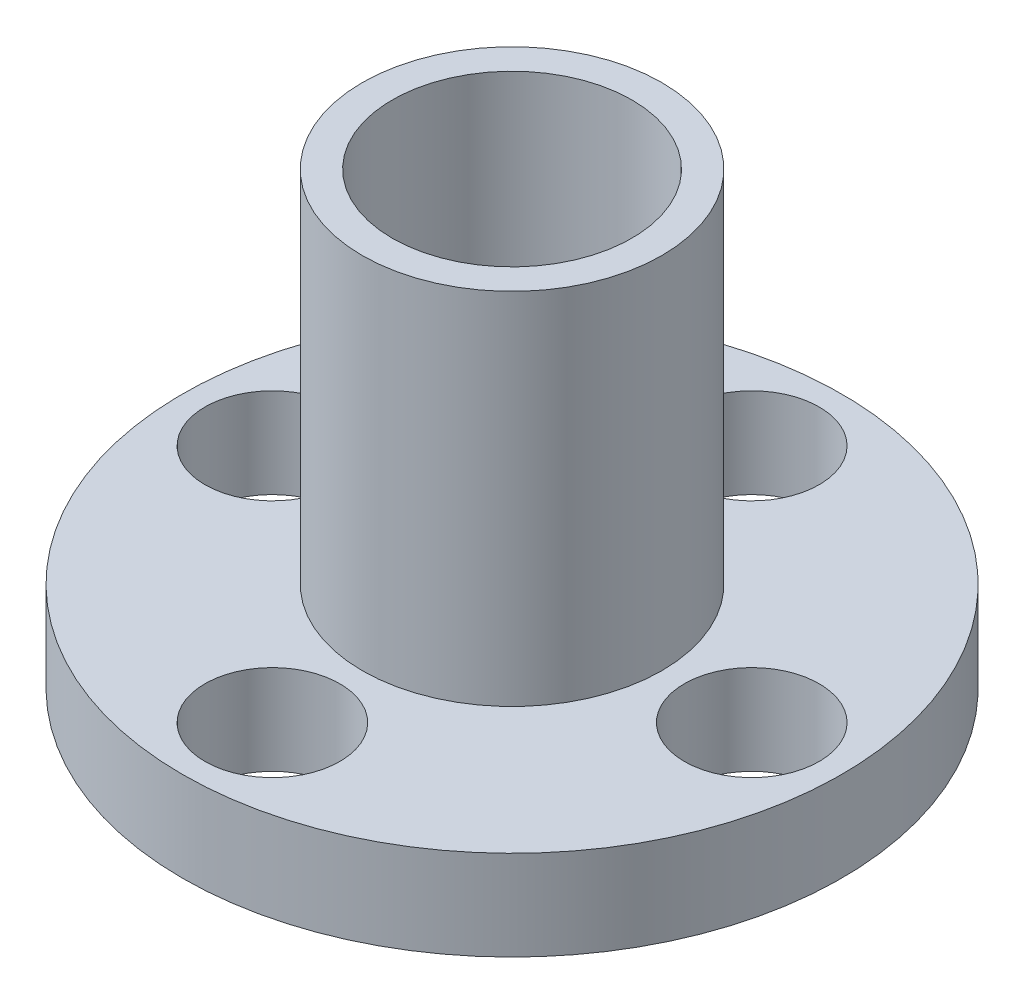
ISO-10303-21;
HEADER;
FILE_DESCRIPTION(('STEP AP214'),'2;1');
FILE_NAME('part.step','',(''),(''),'','','');
FILE_SCHEMA(('AUTOMOTIVE_DESIGN { 1 0 10303 214 1 1 1 1 }'));
ENDSEC;
DATA;
#1=APPLICATION_CONTEXT('core data for automotive mechanical design processes');
#2=APPLICATION_PROTOCOL_DEFINITION('international standard','automotive_design',2000,#1);
#3=PRODUCT_CONTEXT('',#1,'mechanical');
#4=PRODUCT('Part','Part','',(#3));
#5=PRODUCT_RELATED_PRODUCT_CATEGORY('part','',(#4));
#6=PRODUCT_DEFINITION_FORMATION('','',#4);
#7=PRODUCT_DEFINITION_CONTEXT('part definition',#1,'design');
#8=PRODUCT_DEFINITION('design','',#6,#7);
#9=PRODUCT_DEFINITION_SHAPE('','',#8);
#10=(LENGTH_UNIT() NAMED_UNIT(*) SI_UNIT(.MILLI.,.METRE.));
#11=(NAMED_UNIT(*) PLANE_ANGLE_UNIT() SI_UNIT($,.RADIAN.));
#12=(NAMED_UNIT(*) SI_UNIT($,.STERADIAN.) SOLID_ANGLE_UNIT());
#13=UNCERTAINTY_MEASURE_WITH_UNIT(LENGTH_MEASURE(1.E-05),#10,'distance_accuracy_value','');
#14=(GEOMETRIC_REPRESENTATION_CONTEXT(3) GLOBAL_UNCERTAINTY_ASSIGNED_CONTEXT((#13)) GLOBAL_UNIT_ASSIGNED_CONTEXT((#10,
#11,#12)) REPRESENTATION_CONTEXT('',''));
#15=CARTESIAN_POINT('',(0.,0.,0.));
#16=DIRECTION('',(0.,0.,1.));
#17=DIRECTION('',(1.,0.,0.));
#18=AXIS2_PLACEMENT_3D('',#15,#16,#17);
#19=CARTESIAN_POINT('',(0.,3.,0.));
#20=DIRECTION('',(0.,1.,0.));
#21=DIRECTION('',(0.,0.,1.));
#22=AXIS2_PLACEMENT_3D('',#19,#20,#21);
#23=PLANE('',#22);
#24=CARTESIAN_POINT('',(0.,3.,8.));
#25=DIRECTION('',(0.,1.,0.));
#26=DIRECTION('',(0.,0.,1.));
#27=AXIS2_PLACEMENT_3D('',#24,#25,#26);
#28=CIRCLE('',#27,2.25);
#29=CARTESIAN_POINT('',(0.,3.,10.25));
#30=VERTEX_POINT('',#29);
#31=EDGE_CURVE('E72',#30,#30,#28,.T.);
#32=ORIENTED_EDGE('',*,*,#31,.F.);
#33=EDGE_LOOP('',(#32));
#34=FACE_BOUND('',#33,.T.);
#35=CARTESIAN_POINT('',(-8.,3.,0.));
#36=DIRECTION('',(0.,1.,0.));
#37=DIRECTION('',(0.,0.,1.));
#38=AXIS2_PLACEMENT_3D('',#35,#36,#37);
#39=CIRCLE('',#38,2.25);
#40=CARTESIAN_POINT('',(-8.,3.,2.25));
#41=VERTEX_POINT('',#40);
#42=EDGE_CURVE('E66',#41,#41,#39,.T.);
#43=ORIENTED_EDGE('',*,*,#42,.F.);
#44=EDGE_LOOP('',(#43));
#45=FACE_BOUND('',#44,.T.);
#46=CARTESIAN_POINT('',(0.,3.,-8.));
#47=DIRECTION('',(0.,1.,0.));
#48=DIRECTION('',(0.,0.,1.));
#49=AXIS2_PLACEMENT_3D('',#46,#47,#48);
#50=CIRCLE('',#49,2.25);
#51=CARTESIAN_POINT('',(0.,3.,-5.75));
#52=VERTEX_POINT('',#51);
#53=EDGE_CURVE('E60',#52,#52,#50,.T.);
#54=ORIENTED_EDGE('',*,*,#53,.F.);
#55=EDGE_LOOP('',(#54));
#56=FACE_BOUND('',#55,.T.);
#57=CARTESIAN_POINT('',(8.,3.,0.));
#58=DIRECTION('',(0.,1.,0.));
#59=DIRECTION('',(0.,0.,1.));
#60=AXIS2_PLACEMENT_3D('',#57,#58,#59);
#61=CIRCLE('',#60,2.25);
#62=CARTESIAN_POINT('',(8.,3.,2.25));
#63=VERTEX_POINT('',#62);
#64=EDGE_CURVE('E54',#63,#63,#61,.T.);
#65=ORIENTED_EDGE('',*,*,#64,.F.);
#66=EDGE_LOOP('',(#65));
#67=FACE_BOUND('',#66,.T.);
#68=CARTESIAN_POINT('',(0.,3.,0.));
#69=DIRECTION('',(0.,1.,0.));
#70=DIRECTION('',(0.,0.,1.));
#71=AXIS2_PLACEMENT_3D('',#68,#69,#70);
#72=CIRCLE('',#71,11.);
#73=CARTESIAN_POINT('',(0.,3.,11.));
#74=VERTEX_POINT('',#73);
#75=EDGE_CURVE('E10',#74,#74,#72,.T.);
#76=ORIENTED_EDGE('',*,*,#75,.T.);
#77=EDGE_LOOP('',(#76));
#78=FACE_BOUND('',#77,.T.);
#79=CARTESIAN_POINT('',(0.,3.,0.));
#80=DIRECTION('',(0.,1.,0.));
#81=DIRECTION('',(0.,0.,1.));
#82=AXIS2_PLACEMENT_3D('',#79,#80,#81);
#83=CIRCLE('',#82,5.);
#84=CARTESIAN_POINT('',(0.,3.,5.));
#85=VERTEX_POINT('',#84);
#86=EDGE_CURVE('E42',#85,#85,#83,.T.);
#87=ORIENTED_EDGE('',*,*,#86,.F.);
#88=EDGE_LOOP('',(#87));
#89=FACE_BOUND('',#88,.T.);
#90=ADVANCED_FACE('F29',(#34,#45,#56,#67,#78,#89),#23,.T.);
#91=CARTESIAN_POINT('',(0.,3.,0.));
#92=DIRECTION('',(0.,-1.,0.));
#93=DIRECTION('',(0.,0.,-1.));
#94=AXIS2_PLACEMENT_3D('',#91,#92,#93);
#95=CYLINDRICAL_SURFACE('',#94,11.);
#96=ORIENTED_EDGE('',*,*,#75,.F.);
#97=EDGE_LOOP('',(#96));
#98=FACE_BOUND('',#97,.T.);
#99=CARTESIAN_POINT('',(0.,0.,0.));
#100=DIRECTION('',(0.,1.,0.));
#101=DIRECTION('',(0.,0.,1.));
#102=AXIS2_PLACEMENT_3D('',#99,#100,#101);
#103=CIRCLE('',#102,11.);
#104=CARTESIAN_POINT('',(0.,0.,11.));
#105=VERTEX_POINT('',#104);
#106=EDGE_CURVE('E33',#105,#105,#103,.T.);
#107=ORIENTED_EDGE('',*,*,#106,.T.);
#108=EDGE_LOOP('',(#107));
#109=FACE_BOUND('',#108,.T.);
#110=ADVANCED_FACE('F31',(#98,#109),#95,.T.);
#111=CARTESIAN_POINT('',(0.,0.,0.));
#112=DIRECTION('',(0.,1.,0.));
#113=DIRECTION('',(0.,0.,1.));
#114=AXIS2_PLACEMENT_3D('',#111,#112,#113);
#115=PLANE('',#114);
#116=CARTESIAN_POINT('',(0.,0.,8.));
#117=DIRECTION('',(0.,1.,0.));
#118=DIRECTION('',(0.,0.,1.));
#119=AXIS2_PLACEMENT_3D('',#116,#117,#118);
#120=CIRCLE('',#119,2.25);
#121=CARTESIAN_POINT('',(0.,0.,10.25));
#122=VERTEX_POINT('',#121);
#123=EDGE_CURVE('E69',#122,#122,#120,.T.);
#124=ORIENTED_EDGE('',*,*,#123,.T.);
#125=EDGE_LOOP('',(#124));
#126=FACE_BOUND('',#125,.T.);
#127=CARTESIAN_POINT('',(-8.,0.,0.));
#128=DIRECTION('',(0.,1.,0.));
#129=DIRECTION('',(0.,0.,1.));
#130=AXIS2_PLACEMENT_3D('',#127,#128,#129);
#131=CIRCLE('',#130,2.25);
#132=CARTESIAN_POINT('',(-8.,0.,2.25));
#133=VERTEX_POINT('',#132);
#134=EDGE_CURVE('E63',#133,#133,#131,.T.);
#135=ORIENTED_EDGE('',*,*,#134,.T.);
#136=EDGE_LOOP('',(#135));
#137=FACE_BOUND('',#136,.T.);
#138=CARTESIAN_POINT('',(0.,0.,-8.));
#139=DIRECTION('',(0.,1.,0.));
#140=DIRECTION('',(0.,0.,1.));
#141=AXIS2_PLACEMENT_3D('',#138,#139,#140);
#142=CIRCLE('',#141,2.25);
#143=CARTESIAN_POINT('',(0.,0.,-5.75));
#144=VERTEX_POINT('',#143);
#145=EDGE_CURVE('E57',#144,#144,#142,.T.);
#146=ORIENTED_EDGE('',*,*,#145,.T.);
#147=EDGE_LOOP('',(#146));
#148=FACE_BOUND('',#147,.T.);
#149=CARTESIAN_POINT('',(8.,0.,0.));
#150=DIRECTION('',(0.,1.,0.));
#151=DIRECTION('',(0.,0.,1.));
#152=AXIS2_PLACEMENT_3D('',#149,#150,#151);
#153=CIRCLE('',#152,2.25);
#154=CARTESIAN_POINT('',(8.,0.,2.25));
#155=VERTEX_POINT('',#154);
#156=EDGE_CURVE('E51',#155,#155,#153,.T.);
#157=ORIENTED_EDGE('',*,*,#156,.T.);
#158=EDGE_LOOP('',(#157));
#159=FACE_BOUND('',#158,.T.);
#160=CARTESIAN_POINT('',(0.,0.,0.));
#161=DIRECTION('',(0.,1.,0.));
#162=DIRECTION('',(0.,0.,1.));
#163=AXIS2_PLACEMENT_3D('',#160,#161,#162);
#164=CIRCLE('',#163,4.);
#165=CARTESIAN_POINT('',(0.,0.,4.));
#166=VERTEX_POINT('',#165);
#167=EDGE_CURVE('E45',#166,#166,#164,.T.);
#168=ORIENTED_EDGE('',*,*,#167,.T.);
#169=EDGE_LOOP('',(#168));
#170=FACE_BOUND('',#169,.T.);
#171=ORIENTED_EDGE('',*,*,#106,.F.);
#172=EDGE_LOOP('',(#171));
#173=FACE_BOUND('',#172,.T.);
#174=ADVANCED_FACE('F78',(#126,#137,#148,#159,#170,#173),#115,.F.);
#175=CARTESIAN_POINT('',(0.,15.,0.));
#176=DIRECTION('',(0.,-1.,0.));
#177=DIRECTION('',(0.,0.,-1.));
#178=AXIS2_PLACEMENT_3D('',#175,#176,#177);
#179=CYLINDRICAL_SURFACE('',#178,5.);
#180=CARTESIAN_POINT('',(0.,15.,0.));
#181=DIRECTION('',(0.,1.,0.));
#182=DIRECTION('',(0.,0.,1.));
#183=AXIS2_PLACEMENT_3D('',#180,#181,#182);
#184=CIRCLE('',#183,5.);
#185=CARTESIAN_POINT('',(0.,15.,5.));
#186=VERTEX_POINT('',#185);
#187=EDGE_CURVE('E40',#186,#186,#184,.T.);
#188=ORIENTED_EDGE('',*,*,#187,.F.);
#189=EDGE_LOOP('',(#188));
#190=FACE_BOUND('',#189,.T.);
#191=ORIENTED_EDGE('',*,*,#86,.T.);
#192=EDGE_LOOP('',(#191));
#193=FACE_BOUND('',#192,.T.);
#194=ADVANCED_FACE('F99',(#190,#193),#179,.T.);
#195=CARTESIAN_POINT('',(0.,15.,0.));
#196=DIRECTION('',(0.,1.,0.));
#197=DIRECTION('',(0.,0.,1.));
#198=AXIS2_PLACEMENT_3D('',#195,#196,#197);
#199=PLANE('',#198);
#200=CARTESIAN_POINT('',(0.,15.,0.));
#201=DIRECTION('',(0.,1.,0.));
#202=DIRECTION('',(0.,0.,1.));
#203=AXIS2_PLACEMENT_3D('',#200,#201,#202);
#204=CIRCLE('',#203,4.);
#205=CARTESIAN_POINT('',(0.,15.,4.));
#206=VERTEX_POINT('',#205);
#207=EDGE_CURVE('E48',#206,#206,#204,.T.);
#208=ORIENTED_EDGE('',*,*,#207,.F.);
#209=EDGE_LOOP('',(#208));
#210=FACE_BOUND('',#209,.T.);
#211=ORIENTED_EDGE('',*,*,#187,.T.);
#212=EDGE_LOOP('',(#211));
#213=FACE_BOUND('',#212,.T.);
#214=ADVANCED_FACE('F101',(#210,#213),#199,.T.);
#215=CARTESIAN_POINT('',(0.,0.,0.));
#216=DIRECTION('',(0.,1.,0.));
#217=DIRECTION('',(0.,0.,1.));
#218=AXIS2_PLACEMENT_3D('',#215,#216,#217);
#219=CYLINDRICAL_SURFACE('',#218,4.);
#220=ORIENTED_EDGE('',*,*,#167,.F.);
#221=EDGE_LOOP('',(#220));
#222=FACE_BOUND('',#221,.T.);
#223=ORIENTED_EDGE('',*,*,#207,.T.);
#224=EDGE_LOOP('',(#223));
#225=FACE_BOUND('',#224,.T.);
#226=ADVANCED_FACE('F108',(#222,#225),#219,.F.);
#227=CARTESIAN_POINT('',(8.,0.,0.));
#228=DIRECTION('',(0.,1.,0.));
#229=DIRECTION('',(0.,0.,1.));
#230=AXIS2_PLACEMENT_3D('',#227,#228,#229);
#231=CYLINDRICAL_SURFACE('',#230,2.25);
#232=ORIENTED_EDGE('',*,*,#156,.F.);
#233=EDGE_LOOP('',(#232));
#234=FACE_BOUND('',#233,.T.);
#235=ORIENTED_EDGE('',*,*,#64,.T.);
#236=EDGE_LOOP('',(#235));
#237=FACE_BOUND('',#236,.T.);
#238=ADVANCED_FACE('F115',(#234,#237),#231,.F.);
#239=CARTESIAN_POINT('',(0.,0.,-8.));
#240=DIRECTION('',(0.,1.,0.));
#241=DIRECTION('',(0.,0.,1.));
#242=AXIS2_PLACEMENT_3D('',#239,#240,#241);
#243=CYLINDRICAL_SURFACE('',#242,2.25);
#244=ORIENTED_EDGE('',*,*,#145,.F.);
#245=EDGE_LOOP('',(#244));
#246=FACE_BOUND('',#245,.T.);
#247=ORIENTED_EDGE('',*,*,#53,.T.);
#248=EDGE_LOOP('',(#247));
#249=FACE_BOUND('',#248,.T.);
#250=ADVANCED_FACE('F119',(#246,#249),#243,.F.);
#251=CARTESIAN_POINT('',(-8.,0.,0.));
#252=DIRECTION('',(0.,1.,0.));
#253=DIRECTION('',(0.,0.,1.));
#254=AXIS2_PLACEMENT_3D('',#251,#252,#253);
#255=CYLINDRICAL_SURFACE('',#254,2.25);
#256=ORIENTED_EDGE('',*,*,#134,.F.);
#257=EDGE_LOOP('',(#256));
#258=FACE_BOUND('',#257,.T.);
#259=ORIENTED_EDGE('',*,*,#42,.T.);
#260=EDGE_LOOP('',(#259));
#261=FACE_BOUND('',#260,.T.);
#262=ADVANCED_FACE('F84',(#258,#261),#255,.F.);
#263=CARTESIAN_POINT('',(0.,0.,8.));
#264=DIRECTION('',(0.,1.,0.));
#265=DIRECTION('',(0.,0.,1.));
#266=AXIS2_PLACEMENT_3D('',#263,#264,#265);
#267=CYLINDRICAL_SURFACE('',#266,2.25);
#268=ORIENTED_EDGE('',*,*,#123,.F.);
#269=EDGE_LOOP('',(#268));
#270=FACE_BOUND('',#269,.T.);
#271=ORIENTED_EDGE('',*,*,#31,.T.);
#272=EDGE_LOOP('',(#271));
#273=FACE_BOUND('',#272,.T.);
#274=ADVANCED_FACE('F81',(#270,#273),#267,.F.);
#275=CLOSED_SHELL('',(#90,#110,#174,#194,#214,#226,#238,#250,#262,#274));
#276=MANIFOLD_SOLID_BREP('B2',#275);
#277=ADVANCED_BREP_SHAPE_REPRESENTATION('',(#18,#276),#14);
#278=SHAPE_DEFINITION_REPRESENTATION(#9,#277);
ENDSEC;
END-ISO-10303-21;
